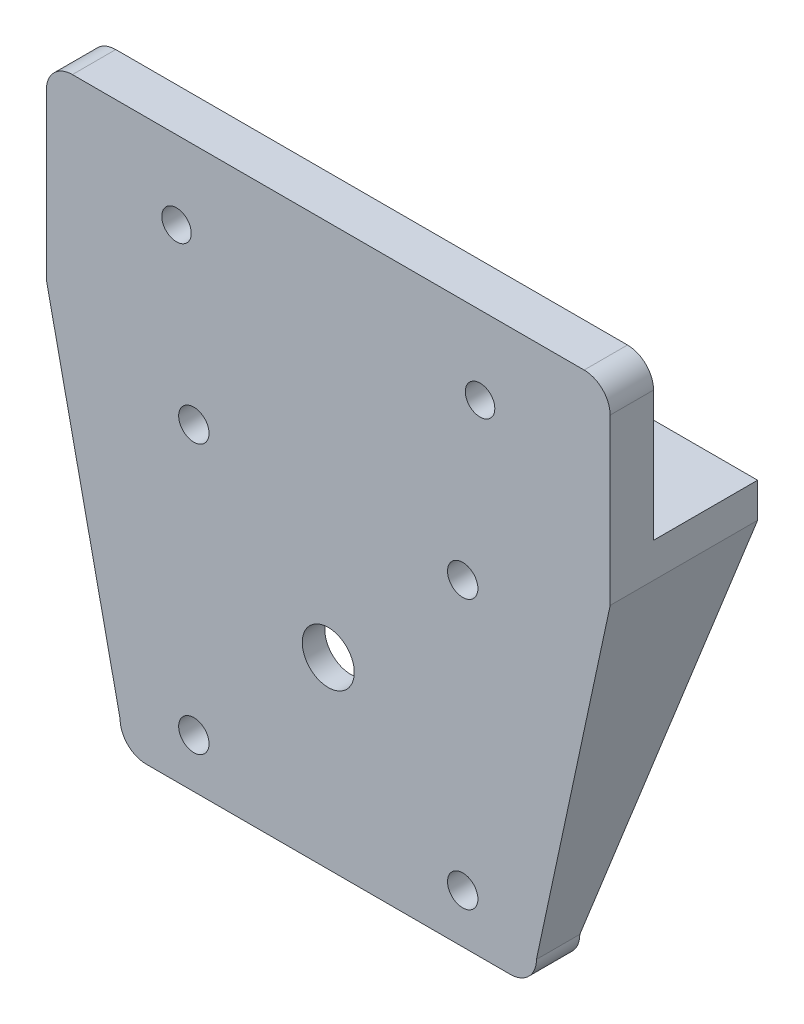
ISO-10303-21;
HEADER;
FILE_DESCRIPTION(('STEP AP214'),'2;1');
FILE_NAME('part.step','',(''),(''),'','','');
FILE_SCHEMA(('AUTOMOTIVE_DESIGN { 1 0 10303 214 1 1 1 1 }'));
ENDSEC;
DATA;
#1=APPLICATION_CONTEXT('core data for automotive mechanical design processes');
#2=APPLICATION_PROTOCOL_DEFINITION('international standard','automotive_design',2000,#1);
#3=PRODUCT_CONTEXT('',#1,'mechanical');
#4=PRODUCT('Part','Part','',(#3));
#5=PRODUCT_RELATED_PRODUCT_CATEGORY('part','',(#4));
#6=PRODUCT_DEFINITION_FORMATION('','',#4);
#7=PRODUCT_DEFINITION_CONTEXT('part definition',#1,'design');
#8=PRODUCT_DEFINITION('design','',#6,#7);
#9=PRODUCT_DEFINITION_SHAPE('','',#8);
#10=(LENGTH_UNIT() NAMED_UNIT(*) SI_UNIT(.MILLI.,.METRE.));
#11=(NAMED_UNIT(*) PLANE_ANGLE_UNIT() SI_UNIT($,.RADIAN.));
#12=(NAMED_UNIT(*) SI_UNIT($,.STERADIAN.) SOLID_ANGLE_UNIT());
#13=UNCERTAINTY_MEASURE_WITH_UNIT(LENGTH_MEASURE(1.E-05),#10,'distance_accuracy_value','');
#14=(GEOMETRIC_REPRESENTATION_CONTEXT(3) GLOBAL_UNCERTAINTY_ASSIGNED_CONTEXT((#13)) GLOBAL_UNIT_ASSIGNED_CONTEXT((#10,
#11,#12)) REPRESENTATION_CONTEXT('',''));
#15=CARTESIAN_POINT('',(0.,0.,0.));
#16=DIRECTION('',(0.,0.,1.));
#17=DIRECTION('',(1.,0.,0.));
#18=AXIS2_PLACEMENT_3D('',#15,#16,#17);
#19=CARTESIAN_POINT('',(-12.5,32.3,-6.));
#20=DIRECTION('',(0.,-1.,0.));
#21=DIRECTION('',(0.,0.,-1.));
#22=AXIS2_PLACEMENT_3D('',#19,#20,#21);
#23=CYLINDRICAL_SURFACE('',#22,1.7);
#24=CARTESIAN_POINT('',(-12.5,14.3,-6.));
#25=DIRECTION('',(0.,-1.,0.));
#26=DIRECTION('',(0.,0.,-1.));
#27=AXIS2_PLACEMENT_3D('',#24,#25,#26);
#28=CIRCLE('',#27,1.7);
#29=CARTESIAN_POINT('',(-12.5,14.3,-7.7));
#30=VERTEX_POINT('',#29);
#31=EDGE_CURVE('E252',#30,#30,#28,.T.);
#32=ORIENTED_EDGE('',*,*,#31,.F.);
#33=EDGE_LOOP('',(#32));
#34=FACE_BOUND('',#33,.T.);
#35=CARTESIAN_POINT('',(-12.5,13.7,-6.));
#36=DIRECTION('',(0.,-1.,0.));
#37=DIRECTION('',(0.,0.,-1.));
#38=AXIS2_PLACEMENT_3D('',#35,#36,#37);
#39=CIRCLE('',#38,1.7);
#40=CARTESIAN_POINT('',(-12.5,13.7,-7.7));
#41=VERTEX_POINT('',#40);
#42=EDGE_CURVE('E256',#41,#41,#39,.F.);
#43=ORIENTED_EDGE('',*,*,#42,.F.);
#44=EDGE_LOOP('',(#43));
#45=FACE_BOUND('',#44,.T.);
#46=ADVANCED_FACE('F40',(#34,#45),#23,.F.);
#47=CARTESIAN_POINT('',(12.5,32.3,-6.));
#48=DIRECTION('',(0.,-1.,0.));
#49=DIRECTION('',(0.,0.,-1.));
#50=AXIS2_PLACEMENT_3D('',#47,#48,#49);
#51=CYLINDRICAL_SURFACE('',#50,1.7);
#52=CARTESIAN_POINT('',(12.5,14.3,-6.));
#53=DIRECTION('',(0.,-1.,0.));
#54=DIRECTION('',(0.,0.,-1.));
#55=AXIS2_PLACEMENT_3D('',#52,#53,#54);
#56=CIRCLE('',#55,1.7);
#57=CARTESIAN_POINT('',(12.5,14.3,-7.7));
#58=VERTEX_POINT('',#57);
#59=EDGE_CURVE('E255',#58,#58,#56,.T.);
#60=ORIENTED_EDGE('',*,*,#59,.F.);
#61=EDGE_LOOP('',(#60));
#62=FACE_BOUND('',#61,.T.);
#63=CARTESIAN_POINT('',(12.5,13.7,-6.));
#64=DIRECTION('',(0.,-1.,0.));
#65=DIRECTION('',(0.,0.,-1.));
#66=AXIS2_PLACEMENT_3D('',#63,#64,#65);
#67=CIRCLE('',#66,1.7);
#68=CARTESIAN_POINT('',(12.5,13.7,-7.7));
#69=VERTEX_POINT('',#68);
#70=EDGE_CURVE('E260',#69,#69,#67,.F.);
#71=ORIENTED_EDGE('',*,*,#70,.F.);
#72=EDGE_LOOP('',(#71));
#73=FACE_BOUND('',#72,.T.);
#74=ADVANCED_FACE('F412',(#62,#73),#51,.F.);
#75=CARTESIAN_POINT('',(32.5,10.3,-12.));
#76=DIRECTION('',(0.,1.,0.));
#77=DIRECTION('',(0.,0.,1.));
#78=AXIS2_PLACEMENT_3D('',#75,#76,#77);
#79=PLANE('',#78);
#80=CARTESIAN_POINT('',(-12.5,10.3,-6.));
#81=DIRECTION('',(0.,-1.,0.));
#82=DIRECTION('',(0.,0.,-1.));
#83=AXIS2_PLACEMENT_3D('',#80,#81,#82);
#84=CIRCLE('',#83,3.25);
#85=CARTESIAN_POINT('',(-12.5,10.3,-9.25));
#86=VERTEX_POINT('',#85);
#87=EDGE_CURVE('E313',#86,#86,#84,.T.);
#88=ORIENTED_EDGE('',*,*,#87,.F.);
#89=EDGE_LOOP('',(#88));
#90=FACE_BOUND('',#89,.T.);
#91=CARTESIAN_POINT('',(12.5,10.3,-6.));
#92=DIRECTION('',(0.,-1.,0.));
#93=DIRECTION('',(0.,0.,-1.));
#94=AXIS2_PLACEMENT_3D('',#91,#92,#93);
#95=CIRCLE('',#94,3.25);
#96=CARTESIAN_POINT('',(12.5,10.3,-9.25));
#97=VERTEX_POINT('',#96);
#98=EDGE_CURVE('E316',#97,#97,#95,.T.);
#99=ORIENTED_EDGE('',*,*,#98,.F.);
#100=EDGE_LOOP('',(#99));
#101=FACE_BOUND('',#100,.T.);
#102=DIRECTION('',(0.,0.,1.));
#103=VECTOR('',#102,1.);
#104=CARTESIAN_POINT('',(-21.3,10.3,0.));
#105=LINE('',#104,#103);
#106=CARTESIAN_POINT('',(-21.3,10.3,-12.));
#107=VERTEX_POINT('',#106);
#108=CARTESIAN_POINT('',(-21.3,10.3,0.));
#109=VERTEX_POINT('',#108);
#110=EDGE_CURVE('E259',#107,#109,#105,.T.);
#111=ORIENTED_EDGE('',*,*,#110,.F.);
#112=DIRECTION('',(-1.,0.,0.));
#113=VECTOR('',#112,1.);
#114=CARTESIAN_POINT('',(32.5,10.3,-12.));
#115=LINE('',#114,#113);
#116=CARTESIAN_POINT('',(21.3,10.3,-12.));
#117=VERTEX_POINT('',#116);
#118=EDGE_CURVE('E352',#117,#107,#115,.T.);
#119=ORIENTED_EDGE('',*,*,#118,.F.);
#120=DIRECTION('',(0.,0.,1.));
#121=VECTOR('',#120,1.);
#122=CARTESIAN_POINT('',(21.3,10.3,0.));
#123=LINE('',#122,#121);
#124=CARTESIAN_POINT('',(21.3,10.3,0.));
#125=VERTEX_POINT('',#124);
#126=EDGE_CURVE('E332',#117,#125,#123,.T.);
#127=ORIENTED_EDGE('',*,*,#126,.T.);
#128=DIRECTION('',(-1.,0.,0.));
#129=VECTOR('',#128,1.);
#130=CARTESIAN_POINT('',(32.5,10.3,0.));
#131=LINE('',#130,#129);
#132=EDGE_CURVE('E157',#125,#109,#131,.T.);
#133=ORIENTED_EDGE('',*,*,#132,.T.);
#134=EDGE_LOOP('',(#111,#119,#127,#133));
#135=FACE_BOUND('',#134,.T.);
#136=ADVANCED_FACE('F400',(#90,#101,#135),#79,.F.);
#137=CARTESIAN_POINT('',(21.,29.3,0.));
#138=DIRECTION('',(0.,0.,-1.));
#139=DIRECTION('',(-1.,0.,0.));
#140=AXIS2_PLACEMENT_3D('',#137,#138,#139);
#141=PLANE('',#140);
#142=CARTESIAN_POINT('',(-15.5,-26.65,0.));
#143=DIRECTION('',(0.,0.,1.));
#144=DIRECTION('',(1.,0.,0.));
#145=AXIS2_PLACEMENT_3D('',#142,#143,#144);
#146=CIRCLE('',#145,1.75);
#147=CARTESIAN_POINT('',(-13.75,-26.65,0.));
#148=VERTEX_POINT('',#147);
#149=EDGE_CURVE('E218',#148,#148,#146,.T.);
#150=ORIENTED_EDGE('',*,*,#149,.T.);
#151=EDGE_LOOP('',(#150));
#152=FACE_BOUND('',#151,.T.);
#153=CARTESIAN_POINT('',(15.5,-26.65,0.));
#154=DIRECTION('',(0.,0.,1.));
#155=DIRECTION('',(1.,0.,0.));
#156=AXIS2_PLACEMENT_3D('',#153,#154,#155);
#157=CIRCLE('',#156,1.75);
#158=CARTESIAN_POINT('',(17.25,-26.65,0.));
#159=VERTEX_POINT('',#158);
#160=EDGE_CURVE('E210',#159,#159,#157,.T.);
#161=ORIENTED_EDGE('',*,*,#160,.T.);
#162=EDGE_LOOP('',(#161));
#163=FACE_BOUND('',#162,.T.);
#164=CARTESIAN_POINT('',(15.5,4.35000000000001,0.));
#165=DIRECTION('',(0.,0.,1.));
#166=DIRECTION('',(1.,0.,0.));
#167=AXIS2_PLACEMENT_3D('',#164,#165,#166);
#168=CIRCLE('',#167,1.75);
#169=CARTESIAN_POINT('',(17.25,4.35000000000001,0.));
#170=VERTEX_POINT('',#169);
#171=EDGE_CURVE('E197',#170,#170,#168,.T.);
#172=ORIENTED_EDGE('',*,*,#171,.T.);
#173=EDGE_LOOP('',(#172));
#174=FACE_BOUND('',#173,.T.);
#175=CARTESIAN_POINT('',(-15.5,4.35000000000001,0.));
#176=DIRECTION('',(0.,0.,1.));
#177=DIRECTION('',(1.,0.,0.));
#178=AXIS2_PLACEMENT_3D('',#175,#176,#177);
#179=CIRCLE('',#178,1.75);
#180=CARTESIAN_POINT('',(-13.75,4.35000000000001,0.));
#181=VERTEX_POINT('',#180);
#182=EDGE_CURVE('E198',#181,#181,#179,.T.);
#183=ORIENTED_EDGE('',*,*,#182,.T.);
#184=EDGE_LOOP('',(#183));
#185=FACE_BOUND('',#184,.T.);
#186=CARTESIAN_POINT('',(0.,-11.15,0.));
#187=DIRECTION('',(0.,0.,-1.));
#188=DIRECTION('',(-1.,0.,0.));
#189=AXIS2_PLACEMENT_3D('',#186,#187,#188);
#190=CIRCLE('',#189,11.15);
#191=CARTESIAN_POINT('',(-11.15,-11.15,0.));
#192=VERTEX_POINT('',#191);
#193=EDGE_CURVE('E180',#192,#192,#190,.T.);
#194=ORIENTED_EDGE('',*,*,#193,.F.);
#195=EDGE_LOOP('',(#194));
#196=FACE_BOUND('',#195,.T.);
#197=CARTESIAN_POINT('',(-21.,-29.3,0.));
#198=DIRECTION('',(0.,0.,1.));
#199=DIRECTION('',(1.,0.,0.));
#200=AXIS2_PLACEMENT_3D('',#197,#198,#199);
#201=CIRCLE('',#200,3.);
#202=CARTESIAN_POINT('',(-24.,-29.3,0.));
#203=VERTEX_POINT('',#202);
#204=CARTESIAN_POINT('',(-21.,-32.3,0.));
#205=VERTEX_POINT('',#204);
#206=EDGE_CURVE('E236',#203,#205,#201,.T.);
#207=ORIENTED_EDGE('',*,*,#206,.F.);
#208=DIRECTION('',(-1.,0.,0.));
#209=VECTOR('',#208,1.);
#210=CARTESIAN_POINT('',(-21.3,-29.3,0.));
#211=LINE('',#210,#209);
#212=CARTESIAN_POINT('',(-21.3,-29.3,0.));
#213=VERTEX_POINT('',#212);
#214=EDGE_CURVE('E327',#213,#203,#211,.T.);
#215=ORIENTED_EDGE('',*,*,#214,.F.);
#216=DIRECTION('',(0.,-1.,0.));
#217=VECTOR('',#216,1.);
#218=CARTESIAN_POINT('',(-21.3,-29.3,0.));
#219=LINE('',#218,#217);
#220=EDGE_CURVE('E325',#109,#213,#219,.T.);
#221=ORIENTED_EDGE('',*,*,#220,.F.);
#222=ORIENTED_EDGE('',*,*,#132,.F.);
#223=DIRECTION('',(0.,-1.,0.));
#224=VECTOR('',#223,1.);
#225=CARTESIAN_POINT('',(21.3,-29.3,0.));
#226=LINE('',#225,#224);
#227=CARTESIAN_POINT('',(21.3,-29.3,0.));
#228=VERTEX_POINT('',#227);
#229=EDGE_CURVE('E335',#125,#228,#226,.T.);
#230=ORIENTED_EDGE('',*,*,#229,.T.);
#231=DIRECTION('',(1.,0.,0.));
#232=VECTOR('',#231,1.);
#233=CARTESIAN_POINT('',(21.3,-29.3,0.));
#234=LINE('',#233,#232);
#235=CARTESIAN_POINT('',(24.,-29.3,0.));
#236=VERTEX_POINT('',#235);
#237=EDGE_CURVE('E341',#228,#236,#234,.T.);
#238=ORIENTED_EDGE('',*,*,#237,.T.);
#239=CARTESIAN_POINT('',(21.,-29.3,0.));
#240=DIRECTION('',(0.,0.,1.));
#241=DIRECTION('',(1.,0.,0.));
#242=AXIS2_PLACEMENT_3D('',#239,#240,#241);
#243=CIRCLE('',#242,3.);
#244=CARTESIAN_POINT('',(21.,-32.3,0.));
#245=VERTEX_POINT('',#244);
#246=EDGE_CURVE('E227',#245,#236,#243,.T.);
#247=ORIENTED_EDGE('',*,*,#246,.F.);
#248=DIRECTION('',(1.,0.,0.));
#249=VECTOR('',#248,1.);
#250=CARTESIAN_POINT('',(-21.,-32.3,0.));
#251=LINE('',#250,#249);
#252=EDGE_CURVE('E238',#205,#245,#251,.T.);
#253=ORIENTED_EDGE('',*,*,#252,.F.);
#254=EDGE_LOOP('',(#207,#215,#221,#222,#230,#238,#247,#253));
#255=FACE_BOUND('',#254,.T.);
#256=ADVANCED_FACE('F389',(#152,#163,#174,#185,#196,#255),#141,.T.);
#257=CARTESIAN_POINT('',(-21.,32.3,5.));
#258=DIRECTION('',(0.,-1.,0.));
#259=DIRECTION('',(0.,0.,-1.));
#260=AXIS2_PLACEMENT_3D('',#257,#258,#259);
#261=PLANE('',#260);
#262=DIRECTION('',(-1.,0.,0.));
#263=VECTOR('',#262,1.);
#264=CARTESIAN_POINT('',(-21.,32.3,0.));
#265=LINE('',#264,#263);
#266=CARTESIAN_POINT('',(29.5,32.3,0.));
#267=VERTEX_POINT('',#266);
#268=CARTESIAN_POINT('',(-29.5,32.3,0.));
#269=VERTEX_POINT('',#268);
#270=EDGE_CURVE('E221',#267,#269,#265,.T.);
#271=ORIENTED_EDGE('',*,*,#270,.T.);
#272=DIRECTION('',(0.,0.,1.));
#273=VECTOR('',#272,1.);
#274=CARTESIAN_POINT('',(-29.5,32.3,5.));
#275=LINE('',#274,#273);
#276=CARTESIAN_POINT('',(-29.5,32.3,5.));
#277=VERTEX_POINT('',#276);
#278=EDGE_CURVE('E275',#269,#277,#275,.T.);
#279=ORIENTED_EDGE('',*,*,#278,.T.);
#280=DIRECTION('',(-1.,0.,0.));
#281=VECTOR('',#280,1.);
#282=CARTESIAN_POINT('',(-21.,32.3,5.));
#283=LINE('',#282,#281);
#284=CARTESIAN_POINT('',(29.5,32.3,5.));
#285=VERTEX_POINT('',#284);
#286=EDGE_CURVE('E224',#285,#277,#283,.T.);
#287=ORIENTED_EDGE('',*,*,#286,.F.);
#288=DIRECTION('',(0.,0.,1.));
#289=VECTOR('',#288,1.);
#290=CARTESIAN_POINT('',(29.5,32.3,5.));
#291=LINE('',#290,#289);
#292=EDGE_CURVE('E271',#285,#267,#291,.F.);
#293=ORIENTED_EDGE('',*,*,#292,.T.);
#294=EDGE_LOOP('',(#271,#279,#287,#293));
#295=FACE_BOUND('',#294,.T.);
#296=ADVANCED_FACE('F281',(#295),#261,.F.);
#297=CARTESIAN_POINT('',(-21.,-29.3,5.));
#298=DIRECTION('',(0.,0.,-1.));
#299=DIRECTION('',(-1.,0.,0.));
#300=AXIS2_PLACEMENT_3D('',#297,#298,#299);
#301=CYLINDRICAL_SURFACE('',#300,3.);
#302=ORIENTED_EDGE('',*,*,#206,.T.);
#303=DIRECTION('',(0.,0.,-1.));
#304=VECTOR('',#303,1.);
#305=CARTESIAN_POINT('',(-21.,-32.3,5.));
#306=LINE('',#305,#304);
#307=CARTESIAN_POINT('',(-21.,-32.3,5.));
#308=VERTEX_POINT('',#307);
#309=EDGE_CURVE('E247',#308,#205,#306,.T.);
#310=ORIENTED_EDGE('',*,*,#309,.F.);
#311=CARTESIAN_POINT('',(-21.,-29.3,5.));
#312=DIRECTION('',(0.,0.,1.));
#313=DIRECTION('',(1.,0.,0.));
#314=AXIS2_PLACEMENT_3D('',#311,#312,#313);
#315=CIRCLE('',#314,3.);
#316=CARTESIAN_POINT('',(-24.,-29.3,5.));
#317=VERTEX_POINT('',#316);
#318=EDGE_CURVE('E226',#317,#308,#315,.T.);
#319=ORIENTED_EDGE('',*,*,#318,.F.);
#320=DIRECTION('',(0.,0.,-1.));
#321=VECTOR('',#320,1.);
#322=CARTESIAN_POINT('',(-24.,-29.3,5.));
#323=LINE('',#322,#321);
#324=EDGE_CURVE('E158',#317,#203,#323,.T.);
#325=ORIENTED_EDGE('',*,*,#324,.T.);
#326=EDGE_LOOP('',(#302,#310,#319,#325));
#327=FACE_BOUND('',#326,.T.);
#328=ADVANCED_FACE('F385',(#327),#301,.T.);
#329=CARTESIAN_POINT('',(-21.,-32.3,5.));
#330=DIRECTION('',(0.,1.,0.));
#331=DIRECTION('',(0.,0.,1.));
#332=AXIS2_PLACEMENT_3D('',#329,#330,#331);
#333=PLANE('',#332);
#334=ORIENTED_EDGE('',*,*,#252,.T.);
#335=DIRECTION('',(0.,0.,-1.));
#336=VECTOR('',#335,1.);
#337=CARTESIAN_POINT('',(21.,-32.3,5.));
#338=LINE('',#337,#336);
#339=CARTESIAN_POINT('',(21.,-32.3,5.));
#340=VERTEX_POINT('',#339);
#341=EDGE_CURVE('E244',#340,#245,#338,.T.);
#342=ORIENTED_EDGE('',*,*,#341,.F.);
#343=DIRECTION('',(1.,0.,0.));
#344=VECTOR('',#343,1.);
#345=CARTESIAN_POINT('',(-21.,-32.3,5.));
#346=LINE('',#345,#344);
#347=EDGE_CURVE('E229',#308,#340,#346,.T.);
#348=ORIENTED_EDGE('',*,*,#347,.F.);
#349=ORIENTED_EDGE('',*,*,#309,.T.);
#350=EDGE_LOOP('',(#334,#342,#348,#349));
#351=FACE_BOUND('',#350,.T.);
#352=ADVANCED_FACE('F388',(#351),#333,.F.);
#353=CARTESIAN_POINT('',(21.,-29.3,5.));
#354=DIRECTION('',(0.,0.,-1.));
#355=DIRECTION('',(-1.,0.,0.));
#356=AXIS2_PLACEMENT_3D('',#353,#354,#355);
#357=CYLINDRICAL_SURFACE('',#356,3.);
#358=ORIENTED_EDGE('',*,*,#246,.T.);
#359=DIRECTION('',(0.,0.,-1.));
#360=VECTOR('',#359,1.);
#361=CARTESIAN_POINT('',(24.,-29.3,5.));
#362=LINE('',#361,#360);
#363=CARTESIAN_POINT('',(24.,-29.3,5.));
#364=VERTEX_POINT('',#363);
#365=EDGE_CURVE('E233',#364,#236,#362,.T.);
#366=ORIENTED_EDGE('',*,*,#365,.F.);
#367=CARTESIAN_POINT('',(21.,-29.3,5.));
#368=DIRECTION('',(0.,0.,1.));
#369=DIRECTION('',(1.,0.,0.));
#370=AXIS2_PLACEMENT_3D('',#367,#368,#369);
#371=CIRCLE('',#370,3.);
#372=EDGE_CURVE('E231',#340,#364,#371,.T.);
#373=ORIENTED_EDGE('',*,*,#372,.F.);
#374=ORIENTED_EDGE('',*,*,#341,.T.);
#375=EDGE_LOOP('',(#358,#366,#373,#374));
#376=FACE_BOUND('',#375,.T.);
#377=ADVANCED_FACE('F367',(#376),#357,.T.);
#378=CARTESIAN_POINT('',(21.,29.3,5.));
#379=DIRECTION('',(0.,0.,-1.));
#380=DIRECTION('',(-1.,0.,0.));
#381=AXIS2_PLACEMENT_3D('',#378,#379,#380);
#382=PLANE('',#381);
#383=ORIENTED_EDGE('',*,*,#286,.T.);
#384=CARTESIAN_POINT('',(-29.5,29.3,5.));
#385=DIRECTION('',(0.,0.,-1.));
#386=DIRECTION('',(-1.,0.,0.));
#387=AXIS2_PLACEMENT_3D('',#384,#385,#386);
#388=CIRCLE('',#387,3.);
#389=CARTESIAN_POINT('',(-32.5,29.3,5.));
#390=VERTEX_POINT('',#389);
#391=EDGE_CURVE('E62',#277,#390,#388,.F.);
#392=ORIENTED_EDGE('',*,*,#391,.T.);
#393=DIRECTION('',(0.,1.,0.));
#394=VECTOR('',#393,1.);
#395=CARTESIAN_POINT('',(-32.5,0.438458538341969,5.));
#396=LINE('',#395,#394);
#397=CARTESIAN_POINT('',(-32.5,10.3,5.));
#398=VERTEX_POINT('',#397);
#399=EDGE_CURVE('E330',#398,#390,#396,.T.);
#400=ORIENTED_EDGE('',*,*,#399,.F.);
#401=DIRECTION('',(-0.209866307638959,0.977730092059148,0.));
#402=VECTOR('',#401,1.);
#403=CARTESIAN_POINT('',(-32.5,10.3,5.));
#404=LINE('',#403,#402);
#405=EDGE_CURVE('E164',#317,#398,#404,.T.);
#406=ORIENTED_EDGE('',*,*,#405,.F.);
#407=ORIENTED_EDGE('',*,*,#318,.T.);
#408=ORIENTED_EDGE('',*,*,#347,.T.);
#409=ORIENTED_EDGE('',*,*,#372,.T.);
#410=DIRECTION('',(0.209866307638959,0.977730092059148,0.));
#411=VECTOR('',#410,1.);
#412=CARTESIAN_POINT('',(32.5,10.3,5.));
#413=LINE('',#412,#411);
#414=CARTESIAN_POINT('',(32.5,10.3,5.));
#415=VERTEX_POINT('',#414);
#416=EDGE_CURVE('E299',#364,#415,#413,.T.);
#417=ORIENTED_EDGE('',*,*,#416,.T.);
#418=DIRECTION('',(0.,1.,0.));
#419=VECTOR('',#418,1.);
#420=CARTESIAN_POINT('',(32.5,0.438458538341978,5.));
#421=LINE('',#420,#419);
#422=CARTESIAN_POINT('',(32.5,29.3,5.));
#423=VERTEX_POINT('',#422);
#424=EDGE_CURVE('E289',#415,#423,#421,.T.);
#425=ORIENTED_EDGE('',*,*,#424,.T.);
#426=CARTESIAN_POINT('',(29.5,29.3,5.));
#427=DIRECTION('',(0.,0.,-1.));
#428=DIRECTION('',(-1.,0.,0.));
#429=AXIS2_PLACEMENT_3D('',#426,#427,#428);
#430=CIRCLE('',#429,3.);
#431=EDGE_CURVE('E269',#423,#285,#430,.F.);
#432=ORIENTED_EDGE('',*,*,#431,.T.);
#433=EDGE_LOOP('',(#383,#392,#400,#406,#407,#408,#409,#417,#425,#432));
#434=FACE_BOUND('',#433,.T.);
#435=CARTESIAN_POINT('',(-15.5,-26.65,5.));
#436=DIRECTION('',(0.,0.,1.));
#437=DIRECTION('',(1.,0.,0.));
#438=AXIS2_PLACEMENT_3D('',#435,#436,#437);
#439=CIRCLE('',#438,1.75);
#440=CARTESIAN_POINT('',(-13.75,-26.65,5.));
#441=VERTEX_POINT('',#440);
#442=EDGE_CURVE('E209',#441,#441,#439,.T.);
#443=ORIENTED_EDGE('',*,*,#442,.F.);
#444=EDGE_LOOP('',(#443));
#445=FACE_BOUND('',#444,.T.);
#446=CARTESIAN_POINT('',(-17.5,23.3,5.));
#447=DIRECTION('',(0.,0.,1.));
#448=DIRECTION('',(1.,0.,0.));
#449=AXIS2_PLACEMENT_3D('',#446,#447,#448);
#450=CIRCLE('',#449,1.7);
#451=CARTESIAN_POINT('',(-15.8,23.3,5.));
#452=VERTEX_POINT('',#451);
#453=EDGE_CURVE('E188',#452,#452,#450,.T.);
#454=ORIENTED_EDGE('',*,*,#453,.F.);
#455=EDGE_LOOP('',(#454));
#456=FACE_BOUND('',#455,.T.);
#457=CARTESIAN_POINT('',(15.5,-26.65,5.));
#458=DIRECTION('',(0.,0.,1.));
#459=DIRECTION('',(1.,0.,0.));
#460=AXIS2_PLACEMENT_3D('',#457,#458,#459);
#461=CIRCLE('',#460,1.75);
#462=CARTESIAN_POINT('',(17.25,-26.65,5.));
#463=VERTEX_POINT('',#462);
#464=EDGE_CURVE('E206',#463,#463,#461,.T.);
#465=ORIENTED_EDGE('',*,*,#464,.F.);
#466=EDGE_LOOP('',(#465));
#467=FACE_BOUND('',#466,.T.);
#468=CARTESIAN_POINT('',(15.5,4.35000000000001,5.));
#469=DIRECTION('',(0.,0.,1.));
#470=DIRECTION('',(1.,0.,0.));
#471=AXIS2_PLACEMENT_3D('',#468,#469,#470);
#472=CIRCLE('',#471,1.75);
#473=CARTESIAN_POINT('',(17.25,4.35000000000001,5.));
#474=VERTEX_POINT('',#473);
#475=EDGE_CURVE('E213',#474,#474,#472,.T.);
#476=ORIENTED_EDGE('',*,*,#475,.F.);
#477=EDGE_LOOP('',(#476));
#478=FACE_BOUND('',#477,.T.);
#479=CARTESIAN_POINT('',(-15.5,4.35000000000001,5.));
#480=DIRECTION('',(0.,0.,1.));
#481=DIRECTION('',(1.,0.,0.));
#482=AXIS2_PLACEMENT_3D('',#479,#480,#481);
#483=CIRCLE('',#482,1.75);
#484=CARTESIAN_POINT('',(-13.75,4.35000000000001,5.));
#485=VERTEX_POINT('',#484);
#486=EDGE_CURVE('E194',#485,#485,#483,.T.);
#487=ORIENTED_EDGE('',*,*,#486,.F.);
#488=EDGE_LOOP('',(#487));
#489=FACE_BOUND('',#488,.T.);
#490=CARTESIAN_POINT('',(17.5,23.3,5.));
#491=DIRECTION('',(0.,0.,1.));
#492=DIRECTION('',(1.,0.,0.));
#493=AXIS2_PLACEMENT_3D('',#490,#491,#492);
#494=CIRCLE('',#493,1.7);
#495=CARTESIAN_POINT('',(19.2,23.3,5.));
#496=VERTEX_POINT('',#495);
#497=EDGE_CURVE('E201',#496,#496,#494,.T.);
#498=ORIENTED_EDGE('',*,*,#497,.F.);
#499=EDGE_LOOP('',(#498));
#500=FACE_BOUND('',#499,.T.);
#501=CARTESIAN_POINT('',(0.,-11.15,5.));
#502=DIRECTION('',(0.,0.,-1.));
#503=DIRECTION('',(-1.,0.,0.));
#504=AXIS2_PLACEMENT_3D('',#501,#502,#503);
#505=CIRCLE('',#504,3.);
#506=CARTESIAN_POINT('',(-3.,-11.15,5.));
#507=VERTEX_POINT('',#506);
#508=EDGE_CURVE('E173',#507,#507,#505,.T.);
#509=ORIENTED_EDGE('',*,*,#508,.T.);
#510=EDGE_LOOP('',(#509));
#511=FACE_BOUND('',#510,.T.);
#512=ADVANCED_FACE('F285',(#434,#445,#456,#467,#478,#489,#500,#511),#382,.F.);
#513=DIRECTION('',(0.,1.,0.));
#514=VECTOR('',#513,1.);
#515=CARTESIAN_POINT('',(-32.5,32.3,0.));
#516=LINE('',#515,#514);
#517=CARTESIAN_POINT('',(-32.5,14.3,0.));
#518=VERTEX_POINT('',#517);
#519=CARTESIAN_POINT('',(-32.5,29.3,0.));
#520=VERTEX_POINT('',#519);
#521=EDGE_CURVE('E149',#518,#520,#516,.T.);
#522=ORIENTED_EDGE('',*,*,#521,.T.);
#523=CARTESIAN_POINT('',(-29.5,29.3,0.));
#524=DIRECTION('',(0.,0.,-1.));
#525=DIRECTION('',(-1.,0.,0.));
#526=AXIS2_PLACEMENT_3D('',#523,#524,#525);
#527=CIRCLE('',#526,3.);
#528=EDGE_CURVE('E11',#520,#269,#527,.T.);
#529=ORIENTED_EDGE('',*,*,#528,.T.);
#530=ORIENTED_EDGE('',*,*,#270,.F.);
#531=CARTESIAN_POINT('',(29.5,29.3,0.));
#532=DIRECTION('',(0.,0.,-1.));
#533=DIRECTION('',(-1.,0.,0.));
#534=AXIS2_PLACEMENT_3D('',#531,#532,#533);
#535=CIRCLE('',#534,3.);
#536=CARTESIAN_POINT('',(32.5,29.3,0.));
#537=VERTEX_POINT('',#536);
#538=EDGE_CURVE('E273',#267,#537,#535,.T.);
#539=ORIENTED_EDGE('',*,*,#538,.T.);
#540=DIRECTION('',(0.,1.,0.));
#541=VECTOR('',#540,1.);
#542=CARTESIAN_POINT('',(32.5,32.3,0.));
#543=LINE('',#542,#541);
#544=CARTESIAN_POINT('',(32.5,14.3,0.));
#545=VERTEX_POINT('',#544);
#546=EDGE_CURVE('E152',#545,#537,#543,.T.);
#547=ORIENTED_EDGE('',*,*,#546,.F.);
#548=DIRECTION('',(1.,0.,0.));
#549=VECTOR('',#548,1.);
#550=CARTESIAN_POINT('',(32.5,14.3,0.));
#551=LINE('',#550,#549);
#552=EDGE_CURVE('E146',#518,#545,#551,.T.);
#553=ORIENTED_EDGE('',*,*,#552,.F.);
#554=EDGE_LOOP('',(#522,#529,#530,#539,#547,#553));
#555=FACE_BOUND('',#554,.T.);
#556=CARTESIAN_POINT('',(17.5,23.3,0.));
#557=DIRECTION('',(0.,0.,1.));
#558=DIRECTION('',(1.,0.,0.));
#559=AXIS2_PLACEMENT_3D('',#556,#557,#558);
#560=CIRCLE('',#559,1.7);
#561=CARTESIAN_POINT('',(19.2,23.3,0.));
#562=VERTEX_POINT('',#561);
#563=EDGE_CURVE('E191',#562,#562,#560,.T.);
#564=ORIENTED_EDGE('',*,*,#563,.T.);
#565=EDGE_LOOP('',(#564));
#566=FACE_BOUND('',#565,.T.);
#567=CARTESIAN_POINT('',(-17.5,23.3,0.));
#568=DIRECTION('',(0.,0.,1.));
#569=DIRECTION('',(1.,0.,0.));
#570=AXIS2_PLACEMENT_3D('',#567,#568,#569);
#571=CIRCLE('',#570,1.7);
#572=CARTESIAN_POINT('',(-15.8,23.3,0.));
#573=VERTEX_POINT('',#572);
#574=EDGE_CURVE('E185',#573,#573,#571,.T.);
#575=ORIENTED_EDGE('',*,*,#574,.T.);
#576=EDGE_LOOP('',(#575));
#577=FACE_BOUND('',#576,.T.);
#578=ADVANCED_FACE('F147',(#555,#566,#577),#141,.T.);
#579=CARTESIAN_POINT('',(-15.5,-26.65,0.));
#580=DIRECTION('',(0.,0.,1.));
#581=DIRECTION('',(1.,0.,0.));
#582=AXIS2_PLACEMENT_3D('',#579,#580,#581);
#583=CYLINDRICAL_SURFACE('',#582,1.75);
#584=ORIENTED_EDGE('',*,*,#149,.F.);
#585=EDGE_LOOP('',(#584));
#586=FACE_BOUND('',#585,.T.);
#587=ORIENTED_EDGE('',*,*,#442,.T.);
#588=EDGE_LOOP('',(#587));
#589=FACE_BOUND('',#588,.T.);
#590=ADVANCED_FACE('F467',(#586,#589),#583,.F.);
#591=CARTESIAN_POINT('',(-17.5,23.3,0.));
#592=DIRECTION('',(0.,0.,1.));
#593=DIRECTION('',(1.,0.,0.));
#594=AXIS2_PLACEMENT_3D('',#591,#592,#593);
#595=CYLINDRICAL_SURFACE('',#594,1.7);
#596=ORIENTED_EDGE('',*,*,#574,.F.);
#597=EDGE_LOOP('',(#596));
#598=FACE_BOUND('',#597,.T.);
#599=ORIENTED_EDGE('',*,*,#453,.T.);
#600=EDGE_LOOP('',(#599));
#601=FACE_BOUND('',#600,.T.);
#602=ADVANCED_FACE('F472',(#598,#601),#595,.F.);
#603=CARTESIAN_POINT('',(15.5,-26.65,0.));
#604=DIRECTION('',(0.,0.,1.));
#605=DIRECTION('',(1.,0.,0.));
#606=AXIS2_PLACEMENT_3D('',#603,#604,#605);
#607=CYLINDRICAL_SURFACE('',#606,1.75);
#608=ORIENTED_EDGE('',*,*,#160,.F.);
#609=EDGE_LOOP('',(#608));
#610=FACE_BOUND('',#609,.T.);
#611=ORIENTED_EDGE('',*,*,#464,.T.);
#612=EDGE_LOOP('',(#611));
#613=FACE_BOUND('',#612,.T.);
#614=ADVANCED_FACE('F478',(#610,#613),#607,.F.);
#615=CARTESIAN_POINT('',(15.5,4.35000000000001,0.));
#616=DIRECTION('',(0.,0.,1.));
#617=DIRECTION('',(1.,0.,0.));
#618=AXIS2_PLACEMENT_3D('',#615,#616,#617);
#619=CYLINDRICAL_SURFACE('',#618,1.75);
#620=ORIENTED_EDGE('',*,*,#171,.F.);
#621=EDGE_LOOP('',(#620));
#622=FACE_BOUND('',#621,.T.);
#623=ORIENTED_EDGE('',*,*,#475,.T.);
#624=EDGE_LOOP('',(#623));
#625=FACE_BOUND('',#624,.T.);
#626=ADVANCED_FACE('F474',(#622,#625),#619,.F.);
#627=CARTESIAN_POINT('',(-15.5,4.35000000000001,0.));
#628=DIRECTION('',(0.,0.,1.));
#629=DIRECTION('',(1.,0.,0.));
#630=AXIS2_PLACEMENT_3D('',#627,#628,#629);
#631=CYLINDRICAL_SURFACE('',#630,1.75);
#632=ORIENTED_EDGE('',*,*,#182,.F.);
#633=EDGE_LOOP('',(#632));
#634=FACE_BOUND('',#633,.T.);
#635=ORIENTED_EDGE('',*,*,#486,.T.);
#636=EDGE_LOOP('',(#635));
#637=FACE_BOUND('',#636,.T.);
#638=ADVANCED_FACE('F477',(#634,#637),#631,.F.);
#639=CARTESIAN_POINT('',(17.5,23.3,0.));
#640=DIRECTION('',(0.,0.,1.));
#641=DIRECTION('',(1.,0.,0.));
#642=AXIS2_PLACEMENT_3D('',#639,#640,#641);
#643=CYLINDRICAL_SURFACE('',#642,1.7);
#644=ORIENTED_EDGE('',*,*,#563,.F.);
#645=EDGE_LOOP('',(#644));
#646=FACE_BOUND('',#645,.T.);
#647=ORIENTED_EDGE('',*,*,#497,.T.);
#648=EDGE_LOOP('',(#647));
#649=FACE_BOUND('',#648,.T.);
#650=ADVANCED_FACE('F483',(#646,#649),#643,.F.);
#651=CARTESIAN_POINT('',(0.,-11.15,2.4));
#652=DIRECTION('',(0.,0.,-1.));
#653=DIRECTION('',(-1.,0.,0.));
#654=AXIS2_PLACEMENT_3D('',#651,#652,#653);
#655=CYLINDRICAL_SURFACE('',#654,11.15);
#656=CARTESIAN_POINT('',(0.,-11.15,2.4));
#657=DIRECTION('',(0.,0.,-1.));
#658=DIRECTION('',(-1.,0.,0.));
#659=AXIS2_PLACEMENT_3D('',#656,#657,#658);
#660=CIRCLE('',#659,11.15);
#661=CARTESIAN_POINT('',(-11.15,-11.15,2.4));
#662=VERTEX_POINT('',#661);
#663=EDGE_CURVE('E182',#662,#662,#660,.T.);
#664=ORIENTED_EDGE('',*,*,#663,.F.);
#665=EDGE_LOOP('',(#664));
#666=FACE_BOUND('',#665,.T.);
#667=ORIENTED_EDGE('',*,*,#193,.T.);
#668=EDGE_LOOP('',(#667));
#669=FACE_BOUND('',#668,.T.);
#670=ADVANCED_FACE('F486',(#666,#669),#655,.F.);
#671=CARTESIAN_POINT('',(0.,-11.15,2.4));
#672=DIRECTION('',(0.,0.,-1.));
#673=DIRECTION('',(-1.,0.,0.));
#674=AXIS2_PLACEMENT_3D('',#671,#672,#673);
#675=PLANE('',#674);
#676=CARTESIAN_POINT('',(0.,-11.15,2.4));
#677=DIRECTION('',(0.,0.,-1.));
#678=DIRECTION('',(-1.,0.,0.));
#679=AXIS2_PLACEMENT_3D('',#676,#677,#678);
#680=CIRCLE('',#679,3.);
#681=CARTESIAN_POINT('',(-3.,-11.15,2.4));
#682=VERTEX_POINT('',#681);
#683=EDGE_CURVE('E169',#682,#682,#680,.T.);
#684=ORIENTED_EDGE('',*,*,#683,.F.);
#685=EDGE_LOOP('',(#684));
#686=FACE_BOUND('',#685,.T.);
#687=ORIENTED_EDGE('',*,*,#663,.T.);
#688=EDGE_LOOP('',(#687));
#689=FACE_BOUND('',#688,.T.);
#690=ADVANCED_FACE('F496',(#686,#689),#675,.T.);
#691=CARTESIAN_POINT('',(0.,-11.15,5.));
#692=DIRECTION('',(0.,0.,-1.));
#693=DIRECTION('',(-1.,0.,0.));
#694=AXIS2_PLACEMENT_3D('',#691,#692,#693);
#695=CYLINDRICAL_SURFACE('',#694,3.);
#696=ORIENTED_EDGE('',*,*,#508,.F.);
#697=EDGE_LOOP('',(#696));
#698=FACE_BOUND('',#697,.T.);
#699=ORIENTED_EDGE('',*,*,#683,.T.);
#700=EDGE_LOOP('',(#699));
#701=FACE_BOUND('',#700,.T.);
#702=ADVANCED_FACE('F500',(#698,#701),#695,.F.);
#703=CARTESIAN_POINT('',(-32.5,10.3,-12.));
#704=DIRECTION('',(1.,0.,0.));
#705=DIRECTION('',(0.,0.,-1.));
#706=AXIS2_PLACEMENT_3D('',#703,#704,#705);
#707=PLANE('',#706);
#708=ORIENTED_EDGE('',*,*,#399,.T.);
#709=DIRECTION('',(0.,0.,1.));
#710=VECTOR('',#709,1.);
#711=CARTESIAN_POINT('',(-32.5,29.3,-12.));
#712=LINE('',#711,#710);
#713=EDGE_CURVE('E48',#390,#520,#712,.F.);
#714=ORIENTED_EDGE('',*,*,#713,.T.);
#715=ORIENTED_EDGE('',*,*,#521,.F.);
#716=DIRECTION('',(0.,0.,1.));
#717=VECTOR('',#716,1.);
#718=CARTESIAN_POINT('',(-32.5,14.3,-12.));
#719=LINE('',#718,#717);
#720=CARTESIAN_POINT('',(-32.5,14.3,-12.));
#721=VERTEX_POINT('',#720);
#722=EDGE_CURVE('E163',#721,#518,#719,.T.);
#723=ORIENTED_EDGE('',*,*,#722,.F.);
#724=DIRECTION('',(0.,1.,0.));
#725=VECTOR('',#724,1.);
#726=CARTESIAN_POINT('',(-32.5,10.3,-12.));
#727=LINE('',#726,#725);
#728=CARTESIAN_POINT('',(-32.5,10.3,-12.));
#729=VERTEX_POINT('',#728);
#730=EDGE_CURVE('E344',#729,#721,#727,.T.);
#731=ORIENTED_EDGE('',*,*,#730,.F.);
#732=DIRECTION('',(0.,0.,1.));
#733=VECTOR('',#732,1.);
#734=CARTESIAN_POINT('',(-32.5,10.3,-12.));
#735=LINE('',#734,#733);
#736=EDGE_CURVE('E351',#729,#398,#735,.T.);
#737=ORIENTED_EDGE('',*,*,#736,.T.);
#738=EDGE_LOOP('',(#708,#714,#715,#723,#731,#737));
#739=FACE_BOUND('',#738,.T.);
#740=ADVANCED_FACE('F161',(#739),#707,.F.);
#741=CARTESIAN_POINT('',(32.5,14.3,-12.));
#742=DIRECTION('',(0.,-1.,0.));
#743=DIRECTION('',(0.,0.,-1.));
#744=AXIS2_PLACEMENT_3D('',#741,#742,#743);
#745=PLANE('',#744);
#746=ORIENTED_EDGE('',*,*,#59,.T.);
#747=EDGE_LOOP('',(#746));
#748=FACE_BOUND('',#747,.T.);
#749=ORIENTED_EDGE('',*,*,#31,.T.);
#750=EDGE_LOOP('',(#749));
#751=FACE_BOUND('',#750,.T.);
#752=ORIENTED_EDGE('',*,*,#722,.T.);
#753=ORIENTED_EDGE('',*,*,#552,.T.);
#754=DIRECTION('',(0.,0.,1.));
#755=VECTOR('',#754,1.);
#756=CARTESIAN_POINT('',(32.5,14.3,-12.));
#757=LINE('',#756,#755);
#758=CARTESIAN_POINT('',(32.5,14.3,-12.));
#759=VERTEX_POINT('',#758);
#760=EDGE_CURVE('E170',#759,#545,#757,.T.);
#761=ORIENTED_EDGE('',*,*,#760,.F.);
#762=DIRECTION('',(1.,0.,0.));
#763=VECTOR('',#762,1.);
#764=CARTESIAN_POINT('',(32.5,14.3,-12.));
#765=LINE('',#764,#763);
#766=EDGE_CURVE('E167',#721,#759,#765,.T.);
#767=ORIENTED_EDGE('',*,*,#766,.F.);
#768=EDGE_LOOP('',(#752,#753,#761,#767));
#769=FACE_BOUND('',#768,.T.);
#770=ADVANCED_FACE('F166',(#748,#751,#769),#745,.F.);
#771=CARTESIAN_POINT('',(32.5,10.3,-12.));
#772=DIRECTION('',(-1.,0.,0.));
#773=DIRECTION('',(0.,0.,1.));
#774=AXIS2_PLACEMENT_3D('',#771,#772,#773);
#775=PLANE('',#774);
#776=ORIENTED_EDGE('',*,*,#546,.T.);
#777=DIRECTION('',(0.,0.,1.));
#778=VECTOR('',#777,1.);
#779=CARTESIAN_POINT('',(32.5,29.3,-12.));
#780=LINE('',#779,#778);
#781=EDGE_CURVE('E266',#537,#423,#780,.T.);
#782=ORIENTED_EDGE('',*,*,#781,.T.);
#783=ORIENTED_EDGE('',*,*,#424,.F.);
#784=DIRECTION('',(0.,0.,1.));
#785=VECTOR('',#784,1.);
#786=CARTESIAN_POINT('',(32.5,10.3,-12.));
#787=LINE('',#786,#785);
#788=CARTESIAN_POINT('',(32.5,10.3,-12.));
#789=VERTEX_POINT('',#788);
#790=EDGE_CURVE('E175',#789,#415,#787,.T.);
#791=ORIENTED_EDGE('',*,*,#790,.F.);
#792=DIRECTION('',(0.,-1.,0.));
#793=VECTOR('',#792,1.);
#794=CARTESIAN_POINT('',(32.5,10.3,-12.));
#795=LINE('',#794,#793);
#796=EDGE_CURVE('E347',#759,#789,#795,.T.);
#797=ORIENTED_EDGE('',*,*,#796,.F.);
#798=ORIENTED_EDGE('',*,*,#760,.T.);
#799=EDGE_LOOP('',(#776,#782,#783,#791,#797,#798));
#800=FACE_BOUND('',#799,.T.);
#801=ADVANCED_FACE('F295',(#800),#775,.F.);
#802=CARTESIAN_POINT('',(0.,0.,-12.));
#803=DIRECTION('',(0.,0.,1.));
#804=DIRECTION('',(1.,0.,0.));
#805=AXIS2_PLACEMENT_3D('',#802,#803,#804);
#806=PLANE('',#805);
#807=ORIENTED_EDGE('',*,*,#730,.T.);
#808=ORIENTED_EDGE('',*,*,#766,.T.);
#809=ORIENTED_EDGE('',*,*,#796,.T.);
#810=EDGE_CURVE('E350',#789,#117,#115,.T.);
#811=ORIENTED_EDGE('',*,*,#810,.T.);
#812=ORIENTED_EDGE('',*,*,#118,.T.);
#813=EDGE_CURVE('E349',#107,#729,#115,.T.);
#814=ORIENTED_EDGE('',*,*,#813,.T.);
#815=EDGE_LOOP('',(#807,#808,#809,#811,#812,#814));
#816=FACE_BOUND('',#815,.T.);
#817=ADVANCED_FACE('F377',(#816),#806,.F.);
#818=CARTESIAN_POINT('',(21.3,10.3,-12.));
#819=DIRECTION('',(0.,-0.290007395282871,-0.957024404433474));
#820=DIRECTION('',(0.,0.957024404433474,-0.290007395282871));
#821=AXIS2_PLACEMENT_3D('',#818,#819,#820);
#822=PLANE('',#821);
#823=DIRECTION('',(0.,0.957024404433473,-0.290007395282871));
#824=VECTOR('',#823,1.);
#825=CARTESIAN_POINT('',(21.3,10.3,-12.));
#826=LINE('',#825,#824);
#827=EDGE_CURVE('E338',#228,#117,#826,.T.);
#828=ORIENTED_EDGE('',*,*,#827,.T.);
#829=ORIENTED_EDGE('',*,*,#810,.F.);
#830=DIRECTION('',(0.201220211670066,0.937449456721719,-0.284075592945976));
#831=VECTOR('',#830,1.);
#832=CARTESIAN_POINT('',(34.5241750341908,19.7302742769358,-14.8576588717987));
#833=LINE('',#832,#831);
#834=EDGE_CURVE('E302',#236,#789,#833,.T.);
#835=ORIENTED_EDGE('',*,*,#834,.F.);
#836=ORIENTED_EDGE('',*,*,#237,.F.);
#837=EDGE_LOOP('',(#828,#829,#835,#836));
#838=FACE_BOUND('',#837,.T.);
#839=ADVANCED_FACE('F372',(#838),#822,.T.);
#840=CARTESIAN_POINT('',(21.3,0.,0.));
#841=DIRECTION('',(1.,0.,0.));
#842=DIRECTION('',(0.,1.,0.));
#843=AXIS2_PLACEMENT_3D('',#840,#841,#842);
#844=PLANE('',#843);
#845=ORIENTED_EDGE('',*,*,#126,.F.);
#846=ORIENTED_EDGE('',*,*,#827,.F.);
#847=ORIENTED_EDGE('',*,*,#229,.F.);
#848=EDGE_LOOP('',(#845,#846,#847));
#849=FACE_BOUND('',#848,.T.);
#850=ADVANCED_FACE('F402',(#849),#844,.F.);
#851=CARTESIAN_POINT('',(-21.3,10.3,-12.));
#852=DIRECTION('',(0.,0.290007395282871,0.957024404433474));
#853=DIRECTION('',(0.,-0.957024404433474,0.290007395282871));
#854=AXIS2_PLACEMENT_3D('',#851,#852,#853);
#855=PLANE('',#854);
#856=ORIENTED_EDGE('',*,*,#214,.T.);
#857=DIRECTION('',(-0.201220211670066,0.937449456721719,-0.284075592945976));
#858=VECTOR('',#857,1.);
#859=CARTESIAN_POINT('',(-34.5241750341908,19.7302742769358,-14.8576588717987));
#860=LINE('',#859,#858);
#861=EDGE_CURVE('E300',#203,#729,#860,.T.);
#862=ORIENTED_EDGE('',*,*,#861,.T.);
#863=ORIENTED_EDGE('',*,*,#813,.F.);
#864=DIRECTION('',(0.,0.957024404433473,-0.290007395282871));
#865=VECTOR('',#864,1.);
#866=CARTESIAN_POINT('',(-21.3,10.3,-12.));
#867=LINE('',#866,#865);
#868=EDGE_CURVE('E322',#213,#107,#867,.T.);
#869=ORIENTED_EDGE('',*,*,#868,.F.);
#870=EDGE_LOOP('',(#856,#862,#863,#869));
#871=FACE_BOUND('',#870,.T.);
#872=ADVANCED_FACE('F395',(#871),#855,.F.);
#873=CARTESIAN_POINT('',(-21.3,0.,0.));
#874=DIRECTION('',(-1.,0.,0.));
#875=DIRECTION('',(0.,1.,0.));
#876=AXIS2_PLACEMENT_3D('',#873,#874,#875);
#877=PLANE('',#876);
#878=ORIENTED_EDGE('',*,*,#110,.T.);
#879=ORIENTED_EDGE('',*,*,#220,.T.);
#880=ORIENTED_EDGE('',*,*,#868,.T.);
#881=EDGE_LOOP('',(#878,#879,#880));
#882=FACE_BOUND('',#881,.T.);
#883=ADVANCED_FACE('F398',(#882),#877,.F.);
#884=CARTESIAN_POINT('',(12.5,13.7,-6.));
#885=DIRECTION('',(0.,-1.,0.));
#886=DIRECTION('',(0.,0.,-1.));
#887=AXIS2_PLACEMENT_3D('',#884,#885,#886);
#888=PLANE('',#887);
#889=CARTESIAN_POINT('',(12.5,13.7,-6.));
#890=DIRECTION('',(0.,-1.,0.));
#891=DIRECTION('',(0.,0.,-1.));
#892=AXIS2_PLACEMENT_3D('',#889,#890,#891);
#893=CIRCLE('',#892,3.25);
#894=CARTESIAN_POINT('',(12.5,13.7,-9.25));
#895=VERTEX_POINT('',#894);
#896=EDGE_CURVE('E310',#895,#895,#893,.T.);
#897=ORIENTED_EDGE('',*,*,#896,.T.);
#898=EDGE_LOOP('',(#897));
#899=FACE_BOUND('',#898,.T.);
#900=ORIENTED_EDGE('',*,*,#70,.T.);
#901=EDGE_LOOP('',(#900));
#902=FACE_BOUND('',#901,.T.);
#903=ADVANCED_FACE('F425',(#899,#902),#888,.T.);
#904=CARTESIAN_POINT('',(12.5,13.7,-6.));
#905=DIRECTION('',(0.,-1.,0.));
#906=DIRECTION('',(0.,0.,-1.));
#907=AXIS2_PLACEMENT_3D('',#904,#905,#906);
#908=CYLINDRICAL_SURFACE('',#907,3.25);
#909=ORIENTED_EDGE('',*,*,#896,.F.);
#910=EDGE_LOOP('',(#909));
#911=FACE_BOUND('',#910,.T.);
#912=ORIENTED_EDGE('',*,*,#98,.T.);
#913=EDGE_LOOP('',(#912));
#914=FACE_BOUND('',#913,.T.);
#915=ADVANCED_FACE('F429',(#911,#914),#908,.F.);
#916=CARTESIAN_POINT('',(-12.5,13.7,-6.));
#917=DIRECTION('',(0.,-1.,0.));
#918=DIRECTION('',(0.,0.,-1.));
#919=AXIS2_PLACEMENT_3D('',#916,#917,#918);
#920=PLANE('',#919);
#921=CARTESIAN_POINT('',(-12.5,13.7,-6.));
#922=DIRECTION('',(0.,-1.,0.));
#923=DIRECTION('',(0.,0.,-1.));
#924=AXIS2_PLACEMENT_3D('',#921,#922,#923);
#925=CIRCLE('',#924,3.25);
#926=CARTESIAN_POINT('',(-12.5,13.7,-9.25));
#927=VERTEX_POINT('',#926);
#928=EDGE_CURVE('E263',#927,#927,#925,.T.);
#929=ORIENTED_EDGE('',*,*,#928,.T.);
#930=EDGE_LOOP('',(#929));
#931=FACE_BOUND('',#930,.T.);
#932=ORIENTED_EDGE('',*,*,#42,.T.);
#933=EDGE_LOOP('',(#932));
#934=FACE_BOUND('',#933,.T.);
#935=ADVANCED_FACE('F434',(#931,#934),#920,.T.);
#936=CARTESIAN_POINT('',(-12.5,13.7,-6.));
#937=DIRECTION('',(0.,-1.,0.));
#938=DIRECTION('',(0.,0.,-1.));
#939=AXIS2_PLACEMENT_3D('',#936,#937,#938);
#940=CYLINDRICAL_SURFACE('',#939,3.25);
#941=ORIENTED_EDGE('',*,*,#928,.F.);
#942=EDGE_LOOP('',(#941));
#943=FACE_BOUND('',#942,.T.);
#944=ORIENTED_EDGE('',*,*,#87,.T.);
#945=EDGE_LOOP('',(#944));
#946=FACE_BOUND('',#945,.T.);
#947=ADVANCED_FACE('F439',(#943,#946),#940,.F.);
#948=CARTESIAN_POINT('',(32.5,10.3,-47.4113546349053));
#949=DIRECTION('',(0.977730092059148,-0.209866307638959,0.));
#950=DIRECTION('',(0.209866307638959,0.977730092059148,0.));
#951=AXIS2_PLACEMENT_3D('',#948,#949,#950);
#952=PLANE('',#951);
#953=ORIENTED_EDGE('',*,*,#365,.T.);
#954=ORIENTED_EDGE('',*,*,#834,.T.);
#955=ORIENTED_EDGE('',*,*,#790,.T.);
#956=ORIENTED_EDGE('',*,*,#416,.F.);
#957=EDGE_LOOP('',(#953,#954,#955,#956));
#958=FACE_BOUND('',#957,.T.);
#959=ADVANCED_FACE('F359',(#958),#952,.T.);
#960=CARTESIAN_POINT('',(29.5,29.3,-12.));
#961=DIRECTION('',(0.,0.,1.));
#962=DIRECTION('',(1.,0.,0.));
#963=AXIS2_PLACEMENT_3D('',#960,#961,#962);
#964=CYLINDRICAL_SURFACE('',#963,3.);
#965=ORIENTED_EDGE('',*,*,#538,.F.);
#966=ORIENTED_EDGE('',*,*,#292,.F.);
#967=ORIENTED_EDGE('',*,*,#431,.F.);
#968=ORIENTED_EDGE('',*,*,#781,.F.);
#969=EDGE_LOOP('',(#965,#966,#967,#968));
#970=FACE_BOUND('',#969,.T.);
#971=ADVANCED_FACE('F293',(#970),#964,.T.);
#972=CARTESIAN_POINT('',(-32.5,10.3,-47.4113546349053));
#973=DIRECTION('',(0.977730092059148,0.209866307638959,0.));
#974=DIRECTION('',(-0.209866307638959,0.977730092059148,0.));
#975=AXIS2_PLACEMENT_3D('',#972,#973,#974);
#976=PLANE('',#975);
#977=ORIENTED_EDGE('',*,*,#861,.F.);
#978=ORIENTED_EDGE('',*,*,#324,.F.);
#979=ORIENTED_EDGE('',*,*,#405,.T.);
#980=ORIENTED_EDGE('',*,*,#736,.F.);
#981=EDGE_LOOP('',(#977,#978,#979,#980));
#982=FACE_BOUND('',#981,.T.);
#983=ADVANCED_FACE('F448',(#982),#976,.F.);
#984=CARTESIAN_POINT('',(-29.5,29.3,5.));
#985=DIRECTION('',(0.,0.,1.));
#986=DIRECTION('',(1.,0.,0.));
#987=AXIS2_PLACEMENT_3D('',#984,#985,#986);
#988=CYLINDRICAL_SURFACE('',#987,3.);
#989=ORIENTED_EDGE('',*,*,#528,.F.);
#990=ORIENTED_EDGE('',*,*,#713,.F.);
#991=ORIENTED_EDGE('',*,*,#391,.F.);
#992=ORIENTED_EDGE('',*,*,#278,.F.);
#993=EDGE_LOOP('',(#989,#990,#991,#992));
#994=FACE_BOUND('',#993,.T.);
#995=ADVANCED_FACE('F42',(#994),#988,.T.);
#996=CLOSED_SHELL('',(#46,#74,#136,#256,#296,#328,#352,#377,#512,#578,#590,#602,#614,#626,#638,
#650,#670,#690,#702,#740,#770,#801,#817,#839,#850,#872,#883,#903,#915,#935,#947,#959,#971,#983,#995));
#997=MANIFOLD_SOLID_BREP('B2',#996);
#998=ADVANCED_BREP_SHAPE_REPRESENTATION('',(#18,#997),#14);
#999=SHAPE_DEFINITION_REPRESENTATION(#9,#998);
ENDSEC;
END-ISO-10303-21;
